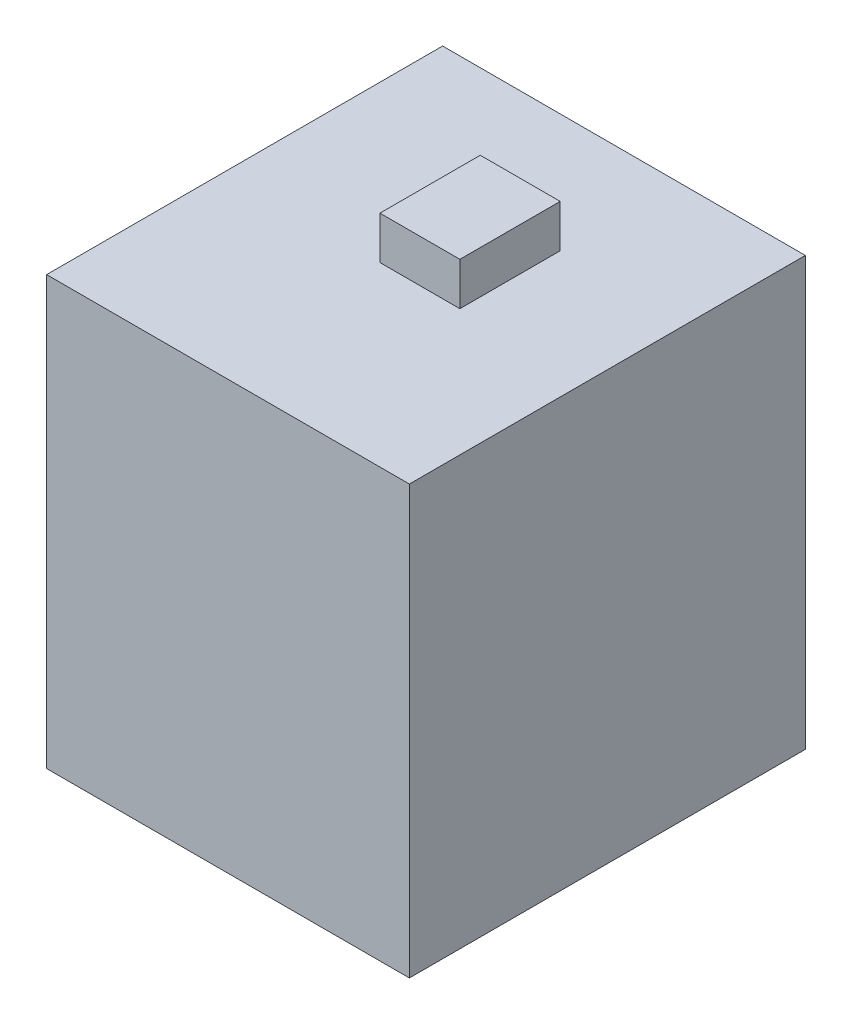
ISO-10303-21;
HEADER;
FILE_DESCRIPTION(('STEP AP214'),'2;1');
FILE_NAME('part.step','',(''),(''),'','','');
FILE_SCHEMA(('AUTOMOTIVE_DESIGN { 1 0 10303 214 1 1 1 1 }'));
ENDSEC;
DATA;
#1=APPLICATION_CONTEXT('core data for automotive mechanical design processes');
#2=APPLICATION_PROTOCOL_DEFINITION('international standard','automotive_design',2000,#1);
#3=PRODUCT_CONTEXT('',#1,'mechanical');
#4=PRODUCT('Part','Part','',(#3));
#5=PRODUCT_RELATED_PRODUCT_CATEGORY('part','',(#4));
#6=PRODUCT_DEFINITION_FORMATION('','',#4);
#7=PRODUCT_DEFINITION_CONTEXT('part definition',#1,'design');
#8=PRODUCT_DEFINITION('design','',#6,#7);
#9=PRODUCT_DEFINITION_SHAPE('','',#8);
#10=(LENGTH_UNIT() NAMED_UNIT(*) SI_UNIT(.MILLI.,.METRE.));
#11=(NAMED_UNIT(*) PLANE_ANGLE_UNIT() SI_UNIT($,.RADIAN.));
#12=(NAMED_UNIT(*) SI_UNIT($,.STERADIAN.) SOLID_ANGLE_UNIT());
#13=UNCERTAINTY_MEASURE_WITH_UNIT(LENGTH_MEASURE(1.E-05),#10,'distance_accuracy_value','');
#14=(GEOMETRIC_REPRESENTATION_CONTEXT(3) GLOBAL_UNCERTAINTY_ASSIGNED_CONTEXT((#13)) GLOBAL_UNIT_ASSIGNED_CONTEXT((#10,
#11,#12)) REPRESENTATION_CONTEXT('',''));
#15=CARTESIAN_POINT('',(0.,0.,0.));
#16=DIRECTION('',(0.,0.,1.));
#17=DIRECTION('',(1.,0.,0.));
#18=AXIS2_PLACEMENT_3D('',#15,#16,#17);
#19=CARTESIAN_POINT('',(0.,100.,0.));
#20=DIRECTION('',(0.,1.,0.));
#21=DIRECTION('',(0.,0.,1.));
#22=AXIS2_PLACEMENT_3D('',#19,#20,#21);
#23=PLANE('',#22);
#24=DIRECTION('',(0.,0.,1.));
#25=VECTOR('',#24,1.);
#26=CARTESIAN_POINT('',(-36.5146721574225,100.,-51.1649357585768));
#27=LINE('',#26,#25);
#28=CARTESIAN_POINT('',(-36.5146721574225,100.,-51.1649357585768));
#29=VERTEX_POINT('',#28);
#30=CARTESIAN_POINT('',(-36.5146721574225,100.,41.3980933578073));
#31=VERTEX_POINT('',#30);
#32=EDGE_CURVE('E150',#29,#31,#27,.T.);
#33=ORIENTED_EDGE('',*,*,#32,.T.);
#34=DIRECTION('',(1.,0.,0.));
#35=VECTOR('',#34,1.);
#36=CARTESIAN_POINT('',(-36.5146721574225,100.,41.3980933578073));
#37=LINE('',#36,#35);
#38=CARTESIAN_POINT('',(48.2792777765313,100.,41.3980933578073));
#39=VERTEX_POINT('',#38);
#40=EDGE_CURVE('E95',#31,#39,#37,.T.);
#41=ORIENTED_EDGE('',*,*,#40,.T.);
#42=DIRECTION('',(0.,0.,-1.));
#43=VECTOR('',#42,1.);
#44=CARTESIAN_POINT('',(48.2792777765313,100.,-51.1649357585768));
#45=LINE('',#44,#43);
#46=CARTESIAN_POINT('',(48.2792777765313,100.,-51.1649357585768));
#47=VERTEX_POINT('',#46);
#48=EDGE_CURVE('E153',#39,#47,#45,.T.);
#49=ORIENTED_EDGE('',*,*,#48,.T.);
#50=DIRECTION('',(-1.,0.,0.));
#51=VECTOR('',#50,1.);
#52=CARTESIAN_POINT('',(-36.5146721574225,100.,-51.1649357585768));
#53=LINE('',#52,#51);
#54=EDGE_CURVE('E67',#47,#29,#53,.T.);
#55=ORIENTED_EDGE('',*,*,#54,.T.);
#56=EDGE_LOOP('',(#33,#41,#49,#55));
#57=FACE_BOUND('',#56,.T.);
#58=DIRECTION('',(1.,0.,0.));
#59=VECTOR('',#58,1.);
#60=CARTESIAN_POINT('',(0.,100.,0.));
#61=LINE('',#60,#59);
#62=CARTESIAN_POINT('',(0.,100.,0.));
#63=VERTEX_POINT('',#62);
#64=CARTESIAN_POINT('',(18.6827019665253,100.,0.));
#65=VERTEX_POINT('',#64);
#66=EDGE_CURVE('E273',#63,#65,#61,.T.);
#67=ORIENTED_EDGE('',*,*,#66,.F.);
#68=DIRECTION('',(0.,0.,1.));
#69=VECTOR('',#68,1.);
#70=CARTESIAN_POINT('',(0.,100.,0.));
#71=LINE('',#70,#69);
#72=CARTESIAN_POINT('',(0.,100.,-23.4497659235591));
#73=VERTEX_POINT('',#72);
#74=EDGE_CURVE('E140',#73,#63,#71,.T.);
#75=ORIENTED_EDGE('',*,*,#74,.F.);
#76=DIRECTION('',(-1.,0.,0.));
#77=VECTOR('',#76,1.);
#78=CARTESIAN_POINT('',(0.,100.,-23.4497659235591));
#79=LINE('',#78,#77);
#80=CARTESIAN_POINT('',(18.6827019665253,100.,-23.4497659235591));
#81=VERTEX_POINT('',#80);
#82=EDGE_CURVE('E136',#81,#73,#79,.T.);
#83=ORIENTED_EDGE('',*,*,#82,.F.);
#84=DIRECTION('',(0.,0.,-1.));
#85=VECTOR('',#84,1.);
#86=CARTESIAN_POINT('',(18.6827019665253,100.,0.));
#87=LINE('',#86,#85);
#88=EDGE_CURVE('E270',#65,#81,#87,.T.);
#89=ORIENTED_EDGE('',*,*,#88,.F.);
#90=EDGE_LOOP('',(#67,#75,#83,#89));
#91=FACE_BOUND('',#90,.T.);
#92=ADVANCED_FACE('F43',(#57,#91),#23,.T.);
#93=CARTESIAN_POINT('',(-36.5146721574225,100.,-51.1649357585768));
#94=DIRECTION('',(1.,0.,0.));
#95=DIRECTION('',(0.,0.,-1.));
#96=AXIS2_PLACEMENT_3D('',#93,#94,#95);
#97=PLANE('',#96);
#98=DIRECTION('',(0.,0.,1.));
#99=VECTOR('',#98,1.);
#100=CARTESIAN_POINT('',(-36.5146721574225,0.,-51.1649357585768));
#101=LINE('',#100,#99);
#102=CARTESIAN_POINT('',(-36.5146721574225,0.,-51.1649357585768));
#103=VERTEX_POINT('',#102);
#104=CARTESIAN_POINT('',(-36.5146721574225,0.,41.3980933578073));
#105=VERTEX_POINT('',#104);
#106=EDGE_CURVE('E142',#103,#105,#101,.T.);
#107=ORIENTED_EDGE('',*,*,#106,.T.);
#108=DIRECTION('',(0.,-1.,0.));
#109=VECTOR('',#108,1.);
#110=CARTESIAN_POINT('',(-36.5146721574225,100.,41.3980933578073));
#111=LINE('',#110,#109);
#112=EDGE_CURVE('E11',#31,#105,#111,.T.);
#113=ORIENTED_EDGE('',*,*,#112,.F.);
#114=ORIENTED_EDGE('',*,*,#32,.F.);
#115=DIRECTION('',(0.,-1.,0.));
#116=VECTOR('',#115,1.);
#117=CARTESIAN_POINT('',(-36.5146721574225,100.,-51.1649357585768));
#118=LINE('',#117,#116);
#119=EDGE_CURVE('E155',#29,#103,#118,.T.);
#120=ORIENTED_EDGE('',*,*,#119,.T.);
#121=EDGE_LOOP('',(#107,#113,#114,#120));
#122=FACE_BOUND('',#121,.T.);
#123=ADVANCED_FACE('F45',(#122),#97,.F.);
#124=CARTESIAN_POINT('',(-36.5146721574225,100.,41.3980933578073));
#125=DIRECTION('',(0.,0.,-1.));
#126=DIRECTION('',(-1.,0.,0.));
#127=AXIS2_PLACEMENT_3D('',#124,#125,#126);
#128=PLANE('',#127);
#129=DIRECTION('',(1.,0.,0.));
#130=VECTOR('',#129,1.);
#131=CARTESIAN_POINT('',(-36.5146721574225,0.,41.3980933578073));
#132=LINE('',#131,#130);
#133=CARTESIAN_POINT('',(48.2792777765313,0.,41.3980933578073));
#134=VERTEX_POINT('',#133);
#135=EDGE_CURVE('E145',#105,#134,#132,.T.);
#136=ORIENTED_EDGE('',*,*,#135,.T.);
#137=DIRECTION('',(0.,-1.,0.));
#138=VECTOR('',#137,1.);
#139=CARTESIAN_POINT('',(48.2792777765313,100.,41.3980933578073));
#140=LINE('',#139,#138);
#141=EDGE_CURVE('E51',#39,#134,#140,.T.);
#142=ORIENTED_EDGE('',*,*,#141,.F.);
#143=ORIENTED_EDGE('',*,*,#40,.F.);
#144=ORIENTED_EDGE('',*,*,#112,.T.);
#145=EDGE_LOOP('',(#136,#142,#143,#144));
#146=FACE_BOUND('',#145,.T.);
#147=ADVANCED_FACE('F183',(#146),#128,.F.);
#148=CARTESIAN_POINT('',(48.2792777765313,100.,-51.1649357585768));
#149=DIRECTION('',(-1.,0.,0.));
#150=DIRECTION('',(0.,0.,1.));
#151=AXIS2_PLACEMENT_3D('',#148,#149,#150);
#152=PLANE('',#151);
#153=DIRECTION('',(0.,0.,-1.));
#154=VECTOR('',#153,1.);
#155=CARTESIAN_POINT('',(48.2792777765313,0.,-51.1649357585768));
#156=LINE('',#155,#154);
#157=CARTESIAN_POINT('',(48.2792777765313,0.,-51.1649357585768));
#158=VERTEX_POINT('',#157);
#159=EDGE_CURVE('E158',#134,#158,#156,.T.);
#160=ORIENTED_EDGE('',*,*,#159,.T.);
#161=DIRECTION('',(0.,-1.,0.));
#162=VECTOR('',#161,1.);
#163=CARTESIAN_POINT('',(48.2792777765313,100.,-51.1649357585768));
#164=LINE('',#163,#162);
#165=EDGE_CURVE('E162',#47,#158,#164,.T.);
#166=ORIENTED_EDGE('',*,*,#165,.F.);
#167=ORIENTED_EDGE('',*,*,#48,.F.);
#168=ORIENTED_EDGE('',*,*,#141,.T.);
#169=EDGE_LOOP('',(#160,#166,#167,#168));
#170=FACE_BOUND('',#169,.T.);
#171=ADVANCED_FACE('F167',(#170),#152,.F.);
#172=CARTESIAN_POINT('',(-36.5146721574225,100.,-51.1649357585768));
#173=DIRECTION('',(0.,0.,1.));
#174=DIRECTION('',(1.,0.,0.));
#175=AXIS2_PLACEMENT_3D('',#172,#173,#174);
#176=PLANE('',#175);
#177=DIRECTION('',(-1.,0.,0.));
#178=VECTOR('',#177,1.);
#179=CARTESIAN_POINT('',(-36.5146721574225,0.,-51.1649357585768));
#180=LINE('',#179,#178);
#181=EDGE_CURVE('E88',#158,#103,#180,.T.);
#182=ORIENTED_EDGE('',*,*,#181,.T.);
#183=ORIENTED_EDGE('',*,*,#119,.F.);
#184=ORIENTED_EDGE('',*,*,#54,.F.);
#185=ORIENTED_EDGE('',*,*,#165,.T.);
#186=EDGE_LOOP('',(#182,#183,#184,#185));
#187=FACE_BOUND('',#186,.T.);
#188=ADVANCED_FACE('F175',(#187),#176,.F.);
#189=CARTESIAN_POINT('',(0.,0.,0.));
#190=DIRECTION('',(0.,1.,0.));
#191=DIRECTION('',(0.,0.,1.));
#192=AXIS2_PLACEMENT_3D('',#189,#190,#191);
#193=PLANE('',#192);
#194=ORIENTED_EDGE('',*,*,#106,.F.);
#195=ORIENTED_EDGE('',*,*,#181,.F.);
#196=ORIENTED_EDGE('',*,*,#159,.F.);
#197=ORIENTED_EDGE('',*,*,#135,.F.);
#198=EDGE_LOOP('',(#194,#195,#196,#197));
#199=FACE_BOUND('',#198,.T.);
#200=ADVANCED_FACE('F171',(#199),#193,.F.);
#201=CARTESIAN_POINT('',(0.,110.,0.));
#202=DIRECTION('',(1.,0.,0.));
#203=DIRECTION('',(0.,0.,-1.));
#204=AXIS2_PLACEMENT_3D('',#201,#202,#203);
#205=PLANE('',#204);
#206=ORIENTED_EDGE('',*,*,#74,.T.);
#207=DIRECTION('',(0.,-1.,0.));
#208=VECTOR('',#207,1.);
#209=CARTESIAN_POINT('',(0.,110.,0.));
#210=LINE('',#209,#208);
#211=CARTESIAN_POINT('',(0.,110.,0.));
#212=VERTEX_POINT('',#211);
#213=EDGE_CURVE('E121',#212,#63,#210,.T.);
#214=ORIENTED_EDGE('',*,*,#213,.F.);
#215=DIRECTION('',(0.,0.,1.));
#216=VECTOR('',#215,1.);
#217=CARTESIAN_POINT('',(0.,110.,0.));
#218=LINE('',#217,#216);
#219=CARTESIAN_POINT('',(0.,110.,-23.4497659235591));
#220=VERTEX_POINT('',#219);
#221=EDGE_CURVE('E128',#220,#212,#218,.T.);
#222=ORIENTED_EDGE('',*,*,#221,.F.);
#223=DIRECTION('',(0.,-1.,0.));
#224=VECTOR('',#223,1.);
#225=CARTESIAN_POINT('',(0.,110.,-23.4497659235591));
#226=LINE('',#225,#224);
#227=EDGE_CURVE('E268',#220,#73,#226,.T.);
#228=ORIENTED_EDGE('',*,*,#227,.T.);
#229=EDGE_LOOP('',(#206,#214,#222,#228));
#230=FACE_BOUND('',#229,.T.);
#231=ADVANCED_FACE('F138',(#230),#205,.F.);
#232=CARTESIAN_POINT('',(0.,110.,0.));
#233=DIRECTION('',(0.,0.,-1.));
#234=DIRECTION('',(-1.,0.,0.));
#235=AXIS2_PLACEMENT_3D('',#232,#233,#234);
#236=PLANE('',#235);
#237=ORIENTED_EDGE('',*,*,#66,.T.);
#238=DIRECTION('',(0.,-1.,0.));
#239=VECTOR('',#238,1.);
#240=CARTESIAN_POINT('',(18.6827019665253,110.,0.));
#241=LINE('',#240,#239);
#242=CARTESIAN_POINT('',(18.6827019665253,110.,0.));
#243=VERTEX_POINT('',#242);
#244=EDGE_CURVE('E124',#243,#65,#241,.T.);
#245=ORIENTED_EDGE('',*,*,#244,.F.);
#246=DIRECTION('',(1.,0.,0.));
#247=VECTOR('',#246,1.);
#248=CARTESIAN_POINT('',(0.,110.,0.));
#249=LINE('',#248,#247);
#250=EDGE_CURVE('E117',#212,#243,#249,.T.);
#251=ORIENTED_EDGE('',*,*,#250,.F.);
#252=ORIENTED_EDGE('',*,*,#213,.T.);
#253=EDGE_LOOP('',(#237,#245,#251,#252));
#254=FACE_BOUND('',#253,.T.);
#255=ADVANCED_FACE('F119',(#254),#236,.F.);
#256=CARTESIAN_POINT('',(18.6827019665253,110.,0.));
#257=DIRECTION('',(-1.,0.,0.));
#258=DIRECTION('',(0.,0.,1.));
#259=AXIS2_PLACEMENT_3D('',#256,#257,#258);
#260=PLANE('',#259);
#261=ORIENTED_EDGE('',*,*,#88,.T.);
#262=DIRECTION('',(0.,-1.,0.));
#263=VECTOR('',#262,1.);
#264=CARTESIAN_POINT('',(18.6827019665253,110.,-23.4497659235591));
#265=LINE('',#264,#263);
#266=CARTESIAN_POINT('',(18.6827019665253,110.,-23.4497659235591));
#267=VERTEX_POINT('',#266);
#268=EDGE_CURVE('E58',#267,#81,#265,.T.);
#269=ORIENTED_EDGE('',*,*,#268,.F.);
#270=DIRECTION('',(0.,0.,-1.));
#271=VECTOR('',#270,1.);
#272=CARTESIAN_POINT('',(18.6827019665253,110.,0.));
#273=LINE('',#272,#271);
#274=EDGE_CURVE('E127',#243,#267,#273,.T.);
#275=ORIENTED_EDGE('',*,*,#274,.F.);
#276=ORIENTED_EDGE('',*,*,#244,.T.);
#277=EDGE_LOOP('',(#261,#269,#275,#276));
#278=FACE_BOUND('',#277,.T.);
#279=ADVANCED_FACE('F196',(#278),#260,.F.);
#280=CARTESIAN_POINT('',(0.,110.,-23.4497659235591));
#281=DIRECTION('',(0.,0.,1.));
#282=DIRECTION('',(1.,0.,0.));
#283=AXIS2_PLACEMENT_3D('',#280,#281,#282);
#284=PLANE('',#283);
#285=ORIENTED_EDGE('',*,*,#82,.T.);
#286=ORIENTED_EDGE('',*,*,#227,.F.);
#287=DIRECTION('',(-1.,0.,0.));
#288=VECTOR('',#287,1.);
#289=CARTESIAN_POINT('',(0.,110.,-23.4497659235591));
#290=LINE('',#289,#288);
#291=EDGE_CURVE('E132',#267,#220,#290,.T.);
#292=ORIENTED_EDGE('',*,*,#291,.F.);
#293=ORIENTED_EDGE('',*,*,#268,.T.);
#294=EDGE_LOOP('',(#285,#286,#292,#293));
#295=FACE_BOUND('',#294,.T.);
#296=ADVANCED_FACE('F199',(#295),#284,.F.);
#297=CARTESIAN_POINT('',(0.,110.,0.));
#298=DIRECTION('',(0.,-1.,0.));
#299=DIRECTION('',(0.,0.,-1.));
#300=AXIS2_PLACEMENT_3D('',#297,#298,#299);
#301=PLANE('',#300);
#302=ORIENTED_EDGE('',*,*,#221,.T.);
#303=ORIENTED_EDGE('',*,*,#250,.T.);
#304=ORIENTED_EDGE('',*,*,#274,.T.);
#305=ORIENTED_EDGE('',*,*,#291,.T.);
#306=EDGE_LOOP('',(#302,#303,#304,#305));
#307=FACE_BOUND('',#306,.T.);
#308=ADVANCED_FACE('F131',(#307),#301,.F.);
#309=CLOSED_SHELL('',(#92,#123,#147,#171,#188,#200,#231,#255,#279,#296,#308));
#310=MANIFOLD_SOLID_BREP('B2',#309);
#311=ADVANCED_BREP_SHAPE_REPRESENTATION('',(#18,#310),#14);
#312=SHAPE_DEFINITION_REPRESENTATION(#9,#311);
ENDSEC;
END-ISO-10303-21;
